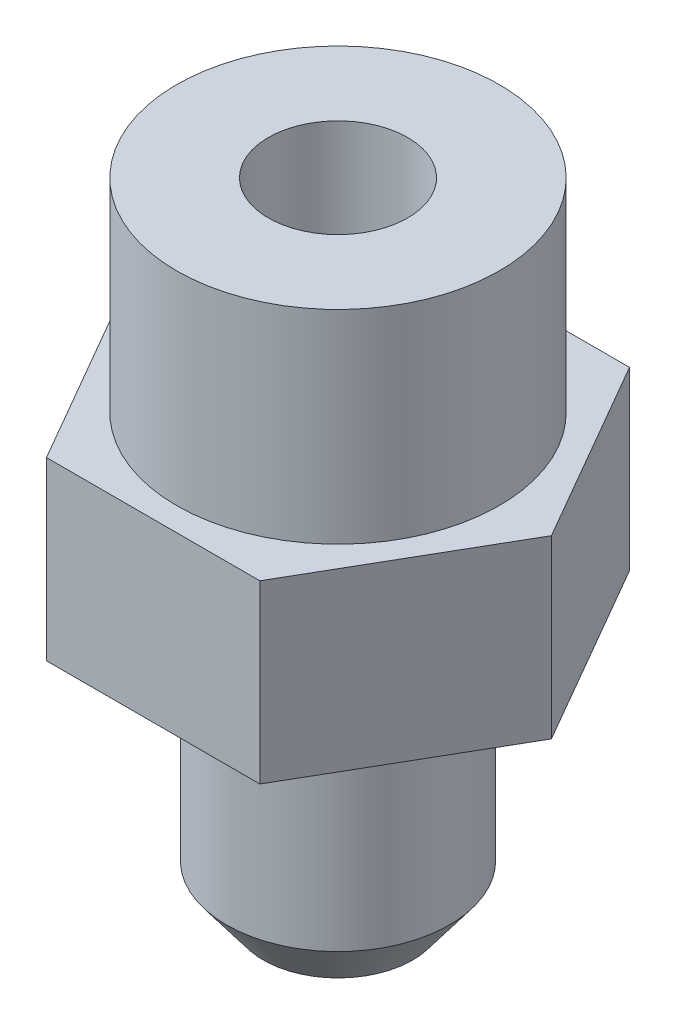
ISO-10303-21;
HEADER;
FILE_DESCRIPTION(('STEP AP214'),'2;1');
FILE_NAME('part.step','',(''),(''),'','','');
FILE_SCHEMA(('AUTOMOTIVE_DESIGN { 1 0 10303 214 1 1 1 1 }'));
ENDSEC;
DATA;
#1=APPLICATION_CONTEXT('core data for automotive mechanical design processes');
#2=APPLICATION_PROTOCOL_DEFINITION('international standard','automotive_design',2000,#1);
#3=PRODUCT_CONTEXT('',#1,'mechanical');
#4=PRODUCT('Part','Part','',(#3));
#5=PRODUCT_RELATED_PRODUCT_CATEGORY('part','',(#4));
#6=PRODUCT_DEFINITION_FORMATION('','',#4);
#7=PRODUCT_DEFINITION_CONTEXT('part definition',#1,'design');
#8=PRODUCT_DEFINITION('design','',#6,#7);
#9=PRODUCT_DEFINITION_SHAPE('','',#8);
#10=(LENGTH_UNIT() NAMED_UNIT(*) SI_UNIT(.MILLI.,.METRE.));
#11=(NAMED_UNIT(*) PLANE_ANGLE_UNIT() SI_UNIT($,.RADIAN.));
#12=(NAMED_UNIT(*) SI_UNIT($,.STERADIAN.) SOLID_ANGLE_UNIT());
#13=UNCERTAINTY_MEASURE_WITH_UNIT(LENGTH_MEASURE(1.E-05),#10,'distance_accuracy_value','');
#14=(GEOMETRIC_REPRESENTATION_CONTEXT(3) GLOBAL_UNCERTAINTY_ASSIGNED_CONTEXT((#13)) GLOBAL_UNIT_ASSIGNED_CONTEXT((#10,
#11,#12)) REPRESENTATION_CONTEXT('',''));
#15=CARTESIAN_POINT('',(0.,0.,0.));
#16=DIRECTION('',(0.,0.,1.));
#17=DIRECTION('',(1.,0.,0.));
#18=AXIS2_PLACEMENT_3D('',#15,#16,#17);
#19=CARTESIAN_POINT('',(0.,-23.6474,0.));
#20=DIRECTION('',(0.,1.,0.));
#21=DIRECTION('',(0.,0.,1.));
#22=AXIS2_PLACEMENT_3D('',#19,#20,#21);
#23=CYLINDRICAL_SURFACE('',#22,6.0325);
#24=CARTESIAN_POINT('',(0.,-9.525,0.));
#25=DIRECTION('',(0.,-1.,0.));
#26=DIRECTION('',(0.,0.,-1.));
#27=AXIS2_PLACEMENT_3D('',#24,#25,#26);
#28=CIRCLE('',#27,6.0325);
#29=CARTESIAN_POINT('',(0.,-9.525,-6.0325));
#30=VERTEX_POINT('',#29);
#31=EDGE_CURVE('E11',#30,#30,#28,.T.);
#32=ORIENTED_EDGE('',*,*,#31,.T.);
#33=EDGE_LOOP('',(#32));
#34=FACE_BOUND('',#33,.T.);
#35=CARTESIAN_POINT('',(0.,-21.0014053301711,0.));
#36=DIRECTION('',(0.,1.,0.));
#37=DIRECTION('',(0.,0.,1.));
#38=AXIS2_PLACEMENT_3D('',#35,#36,#37);
#39=CIRCLE('',#38,6.0325);
#40=CARTESIAN_POINT('',(0.,-21.0014053301711,6.0325));
#41=VERTEX_POINT('',#40);
#42=EDGE_CURVE('E129',#41,#41,#39,.F.);
#43=ORIENTED_EDGE('',*,*,#42,.F.);
#44=EDGE_LOOP('',(#43));
#45=FACE_BOUND('',#44,.T.);
#46=ADVANCED_FACE('F37',(#34,#45),#23,.T.);
#47=CARTESIAN_POINT('',(0.,11.,0.));
#48=DIRECTION('',(0.,-1.,0.));
#49=DIRECTION('',(0.,0.,-1.));
#50=AXIS2_PLACEMENT_3D('',#47,#48,#49);
#51=CYLINDRICAL_SURFACE('',#50,8.73125);
#52=CARTESIAN_POINT('',(0.,11.,0.));
#53=DIRECTION('',(0.,1.,0.));
#54=DIRECTION('',(0.,0.,1.));
#55=AXIS2_PLACEMENT_3D('',#52,#53,#54);
#56=CIRCLE('',#55,8.73125);
#57=CARTESIAN_POINT('',(0.,11.,8.73125));
#58=VERTEX_POINT('',#57);
#59=EDGE_CURVE('E47',#58,#58,#56,.T.);
#60=ORIENTED_EDGE('',*,*,#59,.F.);
#61=EDGE_LOOP('',(#60));
#62=FACE_BOUND('',#61,.T.);
#63=CARTESIAN_POINT('',(0.,0.,0.));
#64=DIRECTION('',(0.,1.,0.));
#65=DIRECTION('',(0.,0.,1.));
#66=AXIS2_PLACEMENT_3D('',#63,#64,#65);
#67=CIRCLE('',#66,8.73125);
#68=CARTESIAN_POINT('',(0.,0.,8.73125));
#69=VERTEX_POINT('',#68);
#70=EDGE_CURVE('E41',#69,#69,#67,.T.);
#71=ORIENTED_EDGE('',*,*,#70,.T.);
#72=EDGE_LOOP('',(#71));
#73=FACE_BOUND('',#72,.T.);
#74=ADVANCED_FACE('F39',(#62,#73),#51,.T.);
#75=CARTESIAN_POINT('',(0.,11.,0.));
#76=DIRECTION('',(0.,1.,0.));
#77=DIRECTION('',(0.,0.,1.));
#78=AXIS2_PLACEMENT_3D('',#75,#76,#77);
#79=PLANE('',#78);
#80=CARTESIAN_POINT('',(0.,11.,0.));
#81=DIRECTION('',(0.,-1.,0.));
#82=DIRECTION('',(0.,0.,-1.));
#83=AXIS2_PLACEMENT_3D('',#80,#81,#82);
#84=CIRCLE('',#83,3.7719);
#85=CARTESIAN_POINT('',(0.,11.,-3.7719));
#86=VERTEX_POINT('',#85);
#87=EDGE_CURVE('E197',#86,#86,#84,.T.);
#88=ORIENTED_EDGE('',*,*,#87,.T.);
#89=EDGE_LOOP('',(#88));
#90=FACE_BOUND('',#89,.T.);
#91=ORIENTED_EDGE('',*,*,#59,.T.);
#92=EDGE_LOOP('',(#91));
#93=FACE_BOUND('',#92,.T.);
#94=ADVANCED_FACE('F178',(#90,#93),#79,.T.);
#95=CARTESIAN_POINT('',(-5.77422437973275,-9.525,10.00125));
#96=DIRECTION('',(0.866025403784439,0.,-0.5));
#97=DIRECTION('',(-0.5,0.,-0.866025403784439));
#98=AXIS2_PLACEMENT_3D('',#95,#96,#97);
#99=PLANE('',#98);
#100=DIRECTION('',(-0.5,0.,-0.866025403784439));
#101=VECTOR('',#100,1.);
#102=CARTESIAN_POINT('',(-5.77422437973275,0.,10.00125));
#103=LINE('',#102,#101);
#104=CARTESIAN_POINT('',(-5.77422437973275,0.,10.00125));
#105=VERTEX_POINT('',#104);
#106=CARTESIAN_POINT('',(-11.5484487594655,0.,0.));
#107=VERTEX_POINT('',#106);
#108=EDGE_CURVE('E125',#105,#107,#103,.T.);
#109=ORIENTED_EDGE('',*,*,#108,.T.);
#110=DIRECTION('',(0.,1.,0.));
#111=VECTOR('',#110,1.);
#112=CARTESIAN_POINT('',(-11.5484487594655,-9.525,0.));
#113=LINE('',#112,#111);
#114=CARTESIAN_POINT('',(-11.5484487594655,-9.525,0.));
#115=VERTEX_POINT('',#114);
#116=EDGE_CURVE('E143',#115,#107,#113,.T.);
#117=ORIENTED_EDGE('',*,*,#116,.F.);
#118=DIRECTION('',(-0.5,0.,-0.866025403784439));
#119=VECTOR('',#118,1.);
#120=CARTESIAN_POINT('',(-5.77422437973275,-9.525,10.00125));
#121=LINE('',#120,#119);
#122=CARTESIAN_POINT('',(-5.77422437973275,-9.525,10.00125));
#123=VERTEX_POINT('',#122);
#124=EDGE_CURVE('E136',#123,#115,#121,.T.);
#125=ORIENTED_EDGE('',*,*,#124,.F.);
#126=DIRECTION('',(0.,1.,0.));
#127=VECTOR('',#126,1.);
#128=CARTESIAN_POINT('',(-5.77422437973275,-9.525,10.00125));
#129=LINE('',#128,#127);
#130=EDGE_CURVE('E121',#123,#105,#129,.T.);
#131=ORIENTED_EDGE('',*,*,#130,.T.);
#132=EDGE_LOOP('',(#109,#117,#125,#131));
#133=FACE_BOUND('',#132,.T.);
#134=ADVANCED_FACE('F160',(#133),#99,.F.);
#135=CARTESIAN_POINT('',(-11.5484487594655,-9.525,0.));
#136=DIRECTION('',(0.866025403784439,0.,0.5));
#137=DIRECTION('',(0.5,0.,-0.866025403784439));
#138=AXIS2_PLACEMENT_3D('',#135,#136,#137);
#139=PLANE('',#138);
#140=DIRECTION('',(0.5,0.,-0.866025403784439));
#141=VECTOR('',#140,1.);
#142=CARTESIAN_POINT('',(-11.5484487594655,0.,0.));
#143=LINE('',#142,#141);
#144=CARTESIAN_POINT('',(-5.77422437973275,0.,-10.00125));
#145=VERTEX_POINT('',#144);
#146=EDGE_CURVE('E128',#107,#145,#143,.T.);
#147=ORIENTED_EDGE('',*,*,#146,.T.);
#148=DIRECTION('',(0.,1.,0.));
#149=VECTOR('',#148,1.);
#150=CARTESIAN_POINT('',(-5.77422437973275,-9.525,-10.00125));
#151=LINE('',#150,#149);
#152=CARTESIAN_POINT('',(-5.77422437973275,-9.525,-10.00125));
#153=VERTEX_POINT('',#152);
#154=EDGE_CURVE('E140',#153,#145,#151,.T.);
#155=ORIENTED_EDGE('',*,*,#154,.F.);
#156=DIRECTION('',(0.5,0.,-0.866025403784439));
#157=VECTOR('',#156,1.);
#158=CARTESIAN_POINT('',(-11.5484487594655,-9.525,0.));
#159=LINE('',#158,#157);
#160=EDGE_CURVE('E94',#115,#153,#159,.T.);
#161=ORIENTED_EDGE('',*,*,#160,.F.);
#162=ORIENTED_EDGE('',*,*,#116,.T.);
#163=EDGE_LOOP('',(#147,#155,#161,#162));
#164=FACE_BOUND('',#163,.T.);
#165=ADVANCED_FACE('F210',(#164),#139,.F.);
#166=CARTESIAN_POINT('',(-5.77422437973275,-9.525,-10.00125));
#167=DIRECTION('',(0.,0.,1.));
#168=DIRECTION('',(1.,0.,0.));
#169=AXIS2_PLACEMENT_3D('',#166,#167,#168);
#170=PLANE('',#169);
#171=DIRECTION('',(1.,0.,0.));
#172=VECTOR('',#171,1.);
#173=CARTESIAN_POINT('',(-5.77422437973275,0.,-10.00125));
#174=LINE('',#173,#172);
#175=CARTESIAN_POINT('',(5.77422437973274,0.,-10.00125));
#176=VERTEX_POINT('',#175);
#177=EDGE_CURVE('E131',#145,#176,#174,.T.);
#178=ORIENTED_EDGE('',*,*,#177,.T.);
#179=DIRECTION('',(0.,1.,0.));
#180=VECTOR('',#179,1.);
#181=CARTESIAN_POINT('',(5.77422437973274,-9.525,-10.00125));
#182=LINE('',#181,#180);
#183=CARTESIAN_POINT('',(5.77422437973274,-9.525,-10.00125));
#184=VERTEX_POINT('',#183);
#185=EDGE_CURVE('E116',#184,#176,#182,.T.);
#186=ORIENTED_EDGE('',*,*,#185,.F.);
#187=DIRECTION('',(1.,0.,0.));
#188=VECTOR('',#187,1.);
#189=CARTESIAN_POINT('',(-5.77422437973275,-9.525,-10.00125));
#190=LINE('',#189,#188);
#191=EDGE_CURVE('E107',#153,#184,#190,.T.);
#192=ORIENTED_EDGE('',*,*,#191,.F.);
#193=ORIENTED_EDGE('',*,*,#154,.T.);
#194=EDGE_LOOP('',(#178,#186,#192,#193));
#195=FACE_BOUND('',#194,.T.);
#196=ADVANCED_FACE('F212',(#195),#170,.F.);
#197=CARTESIAN_POINT('',(5.77422437973274,-9.525,-10.00125));
#198=DIRECTION('',(-0.866025403784439,0.,0.5));
#199=DIRECTION('',(0.5,0.,0.866025403784439));
#200=AXIS2_PLACEMENT_3D('',#197,#198,#199);
#201=PLANE('',#200);
#202=DIRECTION('',(0.5,0.,0.866025403784439));
#203=VECTOR('',#202,1.);
#204=CARTESIAN_POINT('',(5.77422437973274,0.,-10.00125));
#205=LINE('',#204,#203);
#206=CARTESIAN_POINT('',(11.5484487594655,0.,0.));
#207=VERTEX_POINT('',#206);
#208=EDGE_CURVE('E115',#176,#207,#205,.T.);
#209=ORIENTED_EDGE('',*,*,#208,.T.);
#210=DIRECTION('',(0.,1.,0.));
#211=VECTOR('',#210,1.);
#212=CARTESIAN_POINT('',(11.5484487594655,-9.525,0.));
#213=LINE('',#212,#211);
#214=CARTESIAN_POINT('',(11.5484487594655,-9.525,0.));
#215=VERTEX_POINT('',#214);
#216=EDGE_CURVE('E112',#215,#207,#213,.T.);
#217=ORIENTED_EDGE('',*,*,#216,.F.);
#218=DIRECTION('',(0.5,0.,0.866025403784439));
#219=VECTOR('',#218,1.);
#220=CARTESIAN_POINT('',(5.77422437973274,-9.525,-10.00125));
#221=LINE('',#220,#219);
#222=EDGE_CURVE('E101',#184,#215,#221,.T.);
#223=ORIENTED_EDGE('',*,*,#222,.F.);
#224=ORIENTED_EDGE('',*,*,#185,.T.);
#225=EDGE_LOOP('',(#209,#217,#223,#224));
#226=FACE_BOUND('',#225,.T.);
#227=ADVANCED_FACE('F113',(#226),#201,.F.);
#228=CARTESIAN_POINT('',(11.5484487594655,-9.525,0.));
#229=DIRECTION('',(-0.866025403784439,0.,-0.5));
#230=DIRECTION('',(-0.5,0.,0.866025403784438));
#231=AXIS2_PLACEMENT_3D('',#228,#229,#230);
#232=PLANE('',#231);
#233=DIRECTION('',(-0.5,0.,0.866025403784438));
#234=VECTOR('',#233,1.);
#235=CARTESIAN_POINT('',(11.5484487594655,0.,0.));
#236=LINE('',#235,#234);
#237=CARTESIAN_POINT('',(5.77422437973274,0.,10.00125));
#238=VERTEX_POINT('',#237);
#239=EDGE_CURVE('E79',#207,#238,#236,.T.);
#240=ORIENTED_EDGE('',*,*,#239,.T.);
#241=DIRECTION('',(0.,1.,0.));
#242=VECTOR('',#241,1.);
#243=CARTESIAN_POINT('',(5.77422437973274,-9.525,10.00125));
#244=LINE('',#243,#242);
#245=CARTESIAN_POINT('',(5.77422437973274,-9.525,10.00125));
#246=VERTEX_POINT('',#245);
#247=EDGE_CURVE('E117',#246,#238,#244,.T.);
#248=ORIENTED_EDGE('',*,*,#247,.F.);
#249=DIRECTION('',(-0.5,0.,0.866025403784438));
#250=VECTOR('',#249,1.);
#251=CARTESIAN_POINT('',(11.5484487594655,-9.525,0.));
#252=LINE('',#251,#250);
#253=EDGE_CURVE('E105',#215,#246,#252,.T.);
#254=ORIENTED_EDGE('',*,*,#253,.F.);
#255=ORIENTED_EDGE('',*,*,#216,.T.);
#256=EDGE_LOOP('',(#240,#248,#254,#255));
#257=FACE_BOUND('',#256,.T.);
#258=ADVANCED_FACE('F119',(#257),#232,.F.);
#259=CARTESIAN_POINT('',(5.77422437973274,-9.525,10.00125));
#260=DIRECTION('',(0.,0.,-1.));
#261=DIRECTION('',(-1.,0.,0.));
#262=AXIS2_PLACEMENT_3D('',#259,#260,#261);
#263=PLANE('',#262);
#264=DIRECTION('',(-1.,0.,0.));
#265=VECTOR('',#264,1.);
#266=CARTESIAN_POINT('',(5.77422437973274,0.,10.00125));
#267=LINE('',#266,#265);
#268=EDGE_CURVE('E85',#238,#105,#267,.T.);
#269=ORIENTED_EDGE('',*,*,#268,.T.);
#270=ORIENTED_EDGE('',*,*,#130,.F.);
#271=DIRECTION('',(-1.,0.,0.));
#272=VECTOR('',#271,1.);
#273=CARTESIAN_POINT('',(5.77422437973274,-9.525,10.00125));
#274=LINE('',#273,#272);
#275=EDGE_CURVE('E56',#246,#123,#274,.T.);
#276=ORIENTED_EDGE('',*,*,#275,.F.);
#277=ORIENTED_EDGE('',*,*,#247,.T.);
#278=EDGE_LOOP('',(#269,#270,#276,#277));
#279=FACE_BOUND('',#278,.T.);
#280=ADVANCED_FACE('F162',(#279),#263,.F.);
#281=CARTESIAN_POINT('',(0.,-9.525,0.));
#282=DIRECTION('',(0.,-1.,0.));
#283=DIRECTION('',(0.,0.,-1.));
#284=AXIS2_PLACEMENT_3D('',#281,#282,#283);
#285=PLANE('',#284);
#286=ORIENTED_EDGE('',*,*,#31,.F.);
#287=EDGE_LOOP('',(#286));
#288=FACE_BOUND('',#287,.T.);
#289=ORIENTED_EDGE('',*,*,#124,.T.);
#290=ORIENTED_EDGE('',*,*,#160,.T.);
#291=ORIENTED_EDGE('',*,*,#191,.T.);
#292=ORIENTED_EDGE('',*,*,#222,.T.);
#293=ORIENTED_EDGE('',*,*,#253,.T.);
#294=ORIENTED_EDGE('',*,*,#275,.T.);
#295=EDGE_LOOP('',(#289,#290,#291,#292,#293,#294));
#296=FACE_BOUND('',#295,.T.);
#297=ADVANCED_FACE('F103',(#288,#296),#285,.T.);
#298=CARTESIAN_POINT('',(0.,0.,0.));
#299=DIRECTION('',(0.,-1.,0.));
#300=DIRECTION('',(0.,0.,-1.));
#301=AXIS2_PLACEMENT_3D('',#298,#299,#300);
#302=PLANE('',#301);
#303=ORIENTED_EDGE('',*,*,#70,.F.);
#304=EDGE_LOOP('',(#303));
#305=FACE_BOUND('',#304,.T.);
#306=ORIENTED_EDGE('',*,*,#108,.F.);
#307=ORIENTED_EDGE('',*,*,#268,.F.);
#308=ORIENTED_EDGE('',*,*,#239,.F.);
#309=ORIENTED_EDGE('',*,*,#208,.F.);
#310=ORIENTED_EDGE('',*,*,#177,.F.);
#311=ORIENTED_EDGE('',*,*,#146,.F.);
#312=EDGE_LOOP('',(#306,#307,#308,#309,#310,#311));
#313=FACE_BOUND('',#312,.T.);
#314=ADVANCED_FACE('F151',(#305,#313),#302,.F.);
#315=CARTESIAN_POINT('',(0.,-23.6474,0.));
#316=DIRECTION('',(0.,1.,0.));
#317=DIRECTION('',(0.,0.,-1.));
#318=AXIS2_PLACEMENT_3D('',#315,#316,#317);
#319=CONICAL_SURFACE('',#318,4.0386,0.645771823237903);
#320=CARTESIAN_POINT('',(0.,-23.6474,0.));
#321=DIRECTION('',(0.,-1.,0.));
#322=DIRECTION('',(0.,0.,-1.));
#323=AXIS2_PLACEMENT_3D('',#320,#321,#322);
#324=CIRCLE('',#323,4.0386);
#325=CARTESIAN_POINT('',(0.,-23.6474,-4.0386));
#326=VERTEX_POINT('',#325);
#327=EDGE_CURVE('E202',#326,#326,#324,.T.);
#328=ORIENTED_EDGE('',*,*,#327,.F.);
#329=EDGE_LOOP('',(#328));
#330=FACE_BOUND('',#329,.T.);
#331=ORIENTED_EDGE('',*,*,#42,.T.);
#332=EDGE_LOOP('',(#331));
#333=FACE_BOUND('',#332,.T.);
#334=ADVANCED_FACE('F154',(#330,#333),#319,.T.);
#335=CARTESIAN_POINT('',(0.,-23.6474,0.));
#336=DIRECTION('',(0.,-1.,0.));
#337=DIRECTION('',(0.,0.,-1.));
#338=AXIS2_PLACEMENT_3D('',#335,#336,#337);
#339=PLANE('',#338);
#340=CARTESIAN_POINT('',(0.,-23.6474,0.));
#341=DIRECTION('',(0.,-1.,0.));
#342=DIRECTION('',(0.,0.,-1.));
#343=AXIS2_PLACEMENT_3D('',#340,#341,#342);
#344=CIRCLE('',#343,3.7719);
#345=CARTESIAN_POINT('',(0.,-23.6474,-3.7719));
#346=VERTEX_POINT('',#345);
#347=EDGE_CURVE('E200',#346,#346,#344,.T.);
#348=ORIENTED_EDGE('',*,*,#347,.F.);
#349=EDGE_LOOP('',(#348));
#350=FACE_BOUND('',#349,.T.);
#351=ORIENTED_EDGE('',*,*,#327,.T.);
#352=EDGE_LOOP('',(#351));
#353=FACE_BOUND('',#352,.T.);
#354=ADVANCED_FACE('F182',(#350,#353),#339,.T.);
#355=CARTESIAN_POINT('',(0.,11.,0.));
#356=DIRECTION('',(0.,-1.,0.));
#357=DIRECTION('',(0.,0.,-1.));
#358=AXIS2_PLACEMENT_3D('',#355,#356,#357);
#359=CYLINDRICAL_SURFACE('',#358,3.7719);
#360=ORIENTED_EDGE('',*,*,#87,.F.);
#361=EDGE_LOOP('',(#360));
#362=FACE_BOUND('',#361,.T.);
#363=ORIENTED_EDGE('',*,*,#347,.T.);
#364=EDGE_LOOP('',(#363));
#365=FACE_BOUND('',#364,.T.);
#366=ADVANCED_FACE('F185',(#362,#365),#359,.F.);
#367=CLOSED_SHELL('',(#46,#74,#94,#134,#165,#196,#227,#258,#280,#297,#314,#334,#354,#366));
#368=MANIFOLD_SOLID_BREP('B2',#367);
#369=ADVANCED_BREP_SHAPE_REPRESENTATION('',(#18,#368),#14);
#370=SHAPE_DEFINITION_REPRESENTATION(#9,#369);
ENDSEC;
END-ISO-10303-21;
